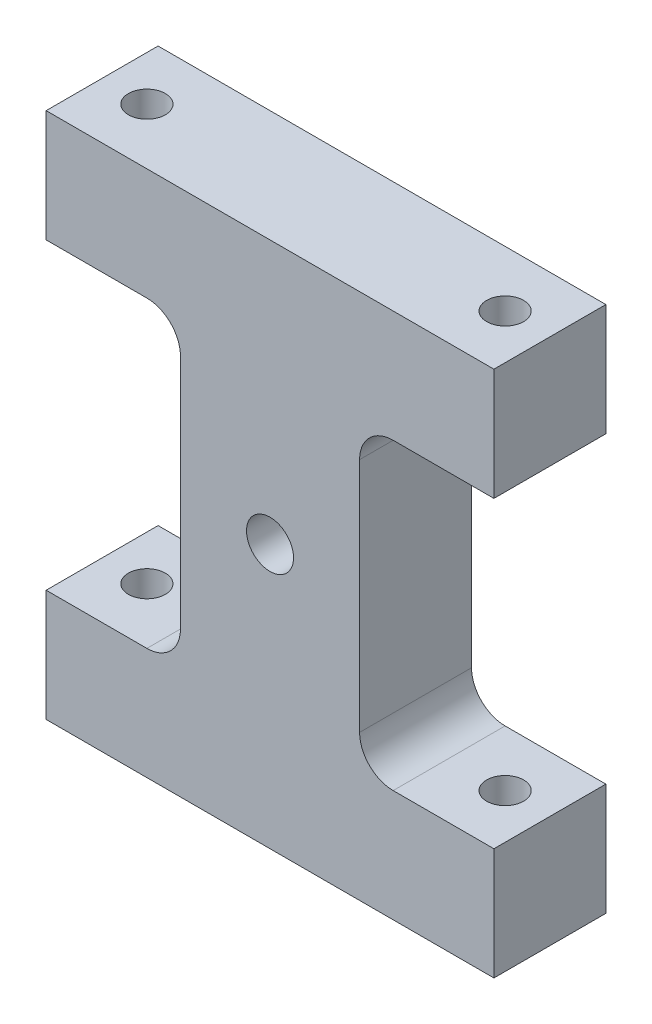
ISO-10303-21;
HEADER;
FILE_DESCRIPTION(('STEP AP214'),'2;1');
FILE_NAME('part.step','',(''),(''),'','','');
FILE_SCHEMA(('AUTOMOTIVE_DESIGN { 1 0 10303 214 1 1 1 1 }'));
ENDSEC;
DATA;
#1=APPLICATION_CONTEXT('core data for automotive mechanical design processes');
#2=APPLICATION_PROTOCOL_DEFINITION('international standard','automotive_design',2000,#1);
#3=PRODUCT_CONTEXT('',#1,'mechanical');
#4=PRODUCT('Part','Part','',(#3));
#5=PRODUCT_RELATED_PRODUCT_CATEGORY('part','',(#4));
#6=PRODUCT_DEFINITION_FORMATION('','',#4);
#7=PRODUCT_DEFINITION_CONTEXT('part definition',#1,'design');
#8=PRODUCT_DEFINITION('design','',#6,#7);
#9=PRODUCT_DEFINITION_SHAPE('','',#8);
#10=(LENGTH_UNIT() NAMED_UNIT(*) SI_UNIT(.MILLI.,.METRE.));
#11=(NAMED_UNIT(*) PLANE_ANGLE_UNIT() SI_UNIT($,.RADIAN.));
#12=(NAMED_UNIT(*) SI_UNIT($,.STERADIAN.) SOLID_ANGLE_UNIT());
#13=UNCERTAINTY_MEASURE_WITH_UNIT(LENGTH_MEASURE(1.E-05),#10,'distance_accuracy_value','');
#14=(GEOMETRIC_REPRESENTATION_CONTEXT(3) GLOBAL_UNCERTAINTY_ASSIGNED_CONTEXT((#13)) GLOBAL_UNIT_ASSIGNED_CONTEXT((#10,
#11,#12)) REPRESENTATION_CONTEXT('',''));
#15=CARTESIAN_POINT('',(0.,0.,0.));
#16=DIRECTION('',(0.,0.,1.));
#17=DIRECTION('',(1.,0.,0.));
#18=AXIS2_PLACEMENT_3D('',#15,#16,#17);
#19=CARTESIAN_POINT('',(-20.,-23.55,10.));
#20=DIRECTION('',(1.,0.,0.));
#21=DIRECTION('',(0.,0.,-1.));
#22=AXIS2_PLACEMENT_3D('',#19,#20,#21);
#23=PLANE('',#22);
#24=DIRECTION('',(0.,0.,-1.));
#25=VECTOR('',#24,1.);
#26=CARTESIAN_POINT('',(-20.,13.55,10.));
#27=LINE('',#26,#25);
#28=CARTESIAN_POINT('',(-20.,13.55,10.));
#29=VERTEX_POINT('',#28);
#30=CARTESIAN_POINT('',(-20.,13.55,0.));
#31=VERTEX_POINT('',#30);
#32=EDGE_CURVE('E209',#29,#31,#27,.T.);
#33=ORIENTED_EDGE('',*,*,#32,.F.);
#34=DIRECTION('',(0.,-1.,0.));
#35=VECTOR('',#34,1.);
#36=CARTESIAN_POINT('',(-20.,-23.55,10.));
#37=LINE('',#36,#35);
#38=CARTESIAN_POINT('',(-20.,23.55,10.));
#39=VERTEX_POINT('',#38);
#40=EDGE_CURVE('E310',#39,#29,#37,.T.);
#41=ORIENTED_EDGE('',*,*,#40,.F.);
#42=DIRECTION('',(0.,0.,-1.));
#43=VECTOR('',#42,1.);
#44=CARTESIAN_POINT('',(-20.,23.55,10.));
#45=LINE('',#44,#43);
#46=CARTESIAN_POINT('',(-20.,23.55,0.));
#47=VERTEX_POINT('',#46);
#48=EDGE_CURVE('E188',#39,#47,#45,.T.);
#49=ORIENTED_EDGE('',*,*,#48,.T.);
#50=DIRECTION('',(0.,-1.,0.));
#51=VECTOR('',#50,1.);
#52=CARTESIAN_POINT('',(-20.,-23.55,0.));
#53=LINE('',#52,#51);
#54=EDGE_CURVE('E172',#47,#31,#53,.T.);
#55=ORIENTED_EDGE('',*,*,#54,.T.);
#56=EDGE_LOOP('',(#33,#41,#49,#55));
#57=FACE_BOUND('',#56,.T.);
#58=ADVANCED_FACE('F38',(#57),#23,.F.);
#59=DIRECTION('',(0.,0.,1.));
#60=VECTOR('',#59,1.);
#61=CARTESIAN_POINT('',(-20.,-13.55,10.));
#62=LINE('',#61,#60);
#63=CARTESIAN_POINT('',(-20.,-13.55,0.));
#64=VERTEX_POINT('',#63);
#65=CARTESIAN_POINT('',(-20.,-13.55,10.));
#66=VERTEX_POINT('',#65);
#67=EDGE_CURVE('E150',#64,#66,#62,.T.);
#68=ORIENTED_EDGE('',*,*,#67,.F.);
#69=CARTESIAN_POINT('',(-20.,-23.55,0.));
#70=VERTEX_POINT('',#69);
#71=EDGE_CURVE('E161',#64,#70,#53,.T.);
#72=ORIENTED_EDGE('',*,*,#71,.T.);
#73=DIRECTION('',(0.,0.,-1.));
#74=VECTOR('',#73,1.);
#75=CARTESIAN_POINT('',(-20.,-23.55,10.));
#76=LINE('',#75,#74);
#77=CARTESIAN_POINT('',(-20.,-23.55,10.));
#78=VERTEX_POINT('',#77);
#79=EDGE_CURVE('E185',#78,#70,#76,.T.);
#80=ORIENTED_EDGE('',*,*,#79,.F.);
#81=EDGE_CURVE('E163',#66,#78,#37,.T.);
#82=ORIENTED_EDGE('',*,*,#81,.F.);
#83=EDGE_LOOP('',(#68,#72,#80,#82));
#84=FACE_BOUND('',#83,.T.);
#85=ADVANCED_FACE('F159',(#84),#23,.F.);
#86=CARTESIAN_POINT('',(0.,0.,10.));
#87=DIRECTION('',(0.,0.,-1.));
#88=DIRECTION('',(-1.,0.,0.));
#89=AXIS2_PLACEMENT_3D('',#86,#87,#88);
#90=PLANE('',#89);
#91=CARTESIAN_POINT('',(0.,0.,10.));
#92=DIRECTION('',(0.,0.,1.));
#93=DIRECTION('',(1.,0.,0.));
#94=AXIS2_PLACEMENT_3D('',#91,#92,#93);
#95=CIRCLE('',#94,2.1);
#96=CARTESIAN_POINT('',(2.1,0.,10.));
#97=VERTEX_POINT('',#96);
#98=EDGE_CURVE('E286',#97,#97,#95,.T.);
#99=ORIENTED_EDGE('',*,*,#98,.F.);
#100=EDGE_LOOP('',(#99));
#101=FACE_BOUND('',#100,.T.);
#102=DIRECTION('',(1.,0.,0.));
#103=VECTOR('',#102,1.);
#104=CARTESIAN_POINT('',(-8.,13.55,10.));
#105=LINE('',#104,#103);
#106=CARTESIAN_POINT('',(-11.,13.55,10.));
#107=VERTEX_POINT('',#106);
#108=EDGE_CURVE('E257',#29,#107,#105,.T.);
#109=ORIENTED_EDGE('',*,*,#108,.T.);
#110=CARTESIAN_POINT('',(-11.,10.55,10.));
#111=DIRECTION('',(0.,0.,-1.));
#112=DIRECTION('',(-1.,0.,0.));
#113=AXIS2_PLACEMENT_3D('',#110,#111,#112);
#114=CIRCLE('',#113,3.);
#115=CARTESIAN_POINT('',(-8.,10.55,10.));
#116=VERTEX_POINT('',#115);
#117=EDGE_CURVE('E236',#107,#116,#114,.T.);
#118=ORIENTED_EDGE('',*,*,#117,.T.);
#119=DIRECTION('',(0.,-1.,0.));
#120=VECTOR('',#119,1.);
#121=CARTESIAN_POINT('',(-8.,-13.55,10.));
#122=LINE('',#121,#120);
#123=CARTESIAN_POINT('',(-8.,-10.55,10.));
#124=VERTEX_POINT('',#123);
#125=EDGE_CURVE('E255',#116,#124,#122,.T.);
#126=ORIENTED_EDGE('',*,*,#125,.T.);
#127=CARTESIAN_POINT('',(-11.,-10.55,10.));
#128=DIRECTION('',(0.,0.,-1.));
#129=DIRECTION('',(-1.,0.,0.));
#130=AXIS2_PLACEMENT_3D('',#127,#128,#129);
#131=CIRCLE('',#130,3.);
#132=CARTESIAN_POINT('',(-11.,-13.55,10.));
#133=VERTEX_POINT('',#132);
#134=EDGE_CURVE('E46',#124,#133,#131,.T.);
#135=ORIENTED_EDGE('',*,*,#134,.T.);
#136=DIRECTION('',(-1.,0.,0.));
#137=VECTOR('',#136,1.);
#138=CARTESIAN_POINT('',(-8.,-13.55,10.));
#139=LINE('',#138,#137);
#140=EDGE_CURVE('E156',#133,#66,#139,.T.);
#141=ORIENTED_EDGE('',*,*,#140,.T.);
#142=ORIENTED_EDGE('',*,*,#81,.T.);
#143=DIRECTION('',(1.,0.,0.));
#144=VECTOR('',#143,1.);
#145=CARTESIAN_POINT('',(-20.,-23.55,10.));
#146=LINE('',#145,#144);
#147=CARTESIAN_POINT('',(20.,-23.55,10.));
#148=VERTEX_POINT('',#147);
#149=EDGE_CURVE('E186',#78,#148,#146,.T.);
#150=ORIENTED_EDGE('',*,*,#149,.T.);
#151=DIRECTION('',(0.,1.,0.));
#152=VECTOR('',#151,1.);
#153=CARTESIAN_POINT('',(20.,-23.55,10.));
#154=LINE('',#153,#152);
#155=CARTESIAN_POINT('',(20.,-13.55,10.));
#156=VERTEX_POINT('',#155);
#157=EDGE_CURVE('E305',#148,#156,#154,.T.);
#158=ORIENTED_EDGE('',*,*,#157,.T.);
#159=DIRECTION('',(1.,0.,0.));
#160=VECTOR('',#159,1.);
#161=CARTESIAN_POINT('',(8.,-13.55,10.));
#162=LINE('',#161,#160);
#163=CARTESIAN_POINT('',(11.,-13.55,10.));
#164=VERTEX_POINT('',#163);
#165=EDGE_CURVE('E268',#164,#156,#162,.T.);
#166=ORIENTED_EDGE('',*,*,#165,.F.);
#167=CARTESIAN_POINT('',(11.,-10.55,10.));
#168=DIRECTION('',(0.,0.,-1.));
#169=DIRECTION('',(-1.,0.,0.));
#170=AXIS2_PLACEMENT_3D('',#167,#168,#169);
#171=CIRCLE('',#170,3.);
#172=CARTESIAN_POINT('',(8.,-10.55,10.));
#173=VERTEX_POINT('',#172);
#174=EDGE_CURVE('E228',#164,#173,#171,.T.);
#175=ORIENTED_EDGE('',*,*,#174,.T.);
#176=DIRECTION('',(0.,-1.,0.));
#177=VECTOR('',#176,1.);
#178=CARTESIAN_POINT('',(8.,-13.55,10.));
#179=LINE('',#178,#177);
#180=CARTESIAN_POINT('',(8.,10.55,10.));
#181=VERTEX_POINT('',#180);
#182=EDGE_CURVE('E271',#181,#173,#179,.T.);
#183=ORIENTED_EDGE('',*,*,#182,.F.);
#184=CARTESIAN_POINT('',(11.,10.55,10.));
#185=DIRECTION('',(0.,0.,-1.));
#186=DIRECTION('',(-1.,0.,0.));
#187=AXIS2_PLACEMENT_3D('',#184,#185,#186);
#188=CIRCLE('',#187,3.);
#189=CARTESIAN_POINT('',(11.,13.55,10.));
#190=VERTEX_POINT('',#189);
#191=EDGE_CURVE('E232',#181,#190,#188,.T.);
#192=ORIENTED_EDGE('',*,*,#191,.T.);
#193=DIRECTION('',(-1.,0.,0.));
#194=VECTOR('',#193,1.);
#195=CARTESIAN_POINT('',(8.,13.55,10.));
#196=LINE('',#195,#194);
#197=CARTESIAN_POINT('',(20.,13.55,10.));
#198=VERTEX_POINT('',#197);
#199=EDGE_CURVE('E267',#198,#190,#196,.T.);
#200=ORIENTED_EDGE('',*,*,#199,.F.);
#201=CARTESIAN_POINT('',(20.,23.55,10.));
#202=VERTEX_POINT('',#201);
#203=EDGE_CURVE('E181',#198,#202,#154,.T.);
#204=ORIENTED_EDGE('',*,*,#203,.T.);
#205=DIRECTION('',(-1.,0.,0.));
#206=VECTOR('',#205,1.);
#207=CARTESIAN_POINT('',(-20.,23.55,10.));
#208=LINE('',#207,#206);
#209=EDGE_CURVE('E308',#202,#39,#208,.T.);
#210=ORIENTED_EDGE('',*,*,#209,.T.);
#211=ORIENTED_EDGE('',*,*,#40,.T.);
#212=EDGE_LOOP('',(#109,#118,#126,#135,#141,#142,#150,#158,#166,#175,#183,#192,#200,#204,#210,#211));
#213=FACE_BOUND('',#212,.T.);
#214=ADVANCED_FACE('F254',(#101,#213),#90,.F.);
#215=CARTESIAN_POINT('',(0.,0.,0.));
#216=DIRECTION('',(0.,0.,-1.));
#217=DIRECTION('',(-1.,0.,0.));
#218=AXIS2_PLACEMENT_3D('',#215,#216,#217);
#219=PLANE('',#218);
#220=CARTESIAN_POINT('',(0.,0.,0.));
#221=DIRECTION('',(0.,0.,-1.));
#222=DIRECTION('',(-1.,0.,0.));
#223=AXIS2_PLACEMENT_3D('',#220,#221,#222);
#224=CIRCLE('',#223,2.1);
#225=CARTESIAN_POINT('',(-2.1,0.,0.));
#226=VERTEX_POINT('',#225);
#227=EDGE_CURVE('E289',#226,#226,#224,.T.);
#228=ORIENTED_EDGE('',*,*,#227,.F.);
#229=EDGE_LOOP('',(#228));
#230=FACE_BOUND('',#229,.T.);
#231=DIRECTION('',(0.,-1.,0.));
#232=VECTOR('',#231,1.);
#233=CARTESIAN_POINT('',(-8.,-13.55,0.));
#234=LINE('',#233,#232);
#235=CARTESIAN_POINT('',(-8.,10.55,0.));
#236=VERTEX_POINT('',#235);
#237=CARTESIAN_POINT('',(-8.,-10.55,0.));
#238=VERTEX_POINT('',#237);
#239=EDGE_CURVE('E206',#236,#238,#234,.T.);
#240=ORIENTED_EDGE('',*,*,#239,.F.);
#241=CARTESIAN_POINT('',(-11.,10.55,0.));
#242=DIRECTION('',(0.,0.,-1.));
#243=DIRECTION('',(-1.,0.,0.));
#244=AXIS2_PLACEMENT_3D('',#241,#242,#243);
#245=CIRCLE('',#244,3.);
#246=CARTESIAN_POINT('',(-11.,13.55,0.));
#247=VERTEX_POINT('',#246);
#248=EDGE_CURVE('E238',#236,#247,#245,.F.);
#249=ORIENTED_EDGE('',*,*,#248,.T.);
#250=DIRECTION('',(1.,0.,0.));
#251=VECTOR('',#250,1.);
#252=CARTESIAN_POINT('',(-8.,13.55,0.));
#253=LINE('',#252,#251);
#254=EDGE_CURVE('E155',#31,#247,#253,.T.);
#255=ORIENTED_EDGE('',*,*,#254,.F.);
#256=ORIENTED_EDGE('',*,*,#54,.F.);
#257=DIRECTION('',(-1.,0.,0.));
#258=VECTOR('',#257,1.);
#259=CARTESIAN_POINT('',(-20.,23.55,0.));
#260=LINE('',#259,#258);
#261=CARTESIAN_POINT('',(20.,23.55,0.));
#262=VERTEX_POINT('',#261);
#263=EDGE_CURVE('E173',#262,#47,#260,.T.);
#264=ORIENTED_EDGE('',*,*,#263,.F.);
#265=DIRECTION('',(0.,1.,0.));
#266=VECTOR('',#265,1.);
#267=CARTESIAN_POINT('',(20.,-23.55,0.));
#268=LINE('',#267,#266);
#269=CARTESIAN_POINT('',(20.,13.55,0.));
#270=VERTEX_POINT('',#269);
#271=EDGE_CURVE('E304',#270,#262,#268,.T.);
#272=ORIENTED_EDGE('',*,*,#271,.F.);
#273=DIRECTION('',(-1.,0.,0.));
#274=VECTOR('',#273,1.);
#275=CARTESIAN_POINT('',(8.,13.55,0.));
#276=LINE('',#275,#274);
#277=CARTESIAN_POINT('',(11.,13.55,0.));
#278=VERTEX_POINT('',#277);
#279=EDGE_CURVE('E270',#270,#278,#276,.T.);
#280=ORIENTED_EDGE('',*,*,#279,.T.);
#281=CARTESIAN_POINT('',(11.,10.55,0.));
#282=DIRECTION('',(0.,0.,-1.));
#283=DIRECTION('',(-1.,0.,0.));
#284=AXIS2_PLACEMENT_3D('',#281,#282,#283);
#285=CIRCLE('',#284,3.);
#286=CARTESIAN_POINT('',(8.,10.55,0.));
#287=VERTEX_POINT('',#286);
#288=EDGE_CURVE('E234',#278,#287,#285,.F.);
#289=ORIENTED_EDGE('',*,*,#288,.T.);
#290=DIRECTION('',(0.,-1.,0.));
#291=VECTOR('',#290,1.);
#292=CARTESIAN_POINT('',(8.,-13.55,0.));
#293=LINE('',#292,#291);
#294=CARTESIAN_POINT('',(8.,-10.55,0.));
#295=VERTEX_POINT('',#294);
#296=EDGE_CURVE('E278',#287,#295,#293,.T.);
#297=ORIENTED_EDGE('',*,*,#296,.T.);
#298=CARTESIAN_POINT('',(11.,-10.55,0.));
#299=DIRECTION('',(0.,0.,-1.));
#300=DIRECTION('',(-1.,0.,0.));
#301=AXIS2_PLACEMENT_3D('',#298,#299,#300);
#302=CIRCLE('',#301,3.);
#303=CARTESIAN_POINT('',(11.,-13.55,0.));
#304=VERTEX_POINT('',#303);
#305=EDGE_CURVE('E230',#295,#304,#302,.F.);
#306=ORIENTED_EDGE('',*,*,#305,.T.);
#307=DIRECTION('',(1.,0.,0.));
#308=VECTOR('',#307,1.);
#309=CARTESIAN_POINT('',(8.,-13.55,0.));
#310=LINE('',#309,#308);
#311=CARTESIAN_POINT('',(20.,-13.55,0.));
#312=VERTEX_POINT('',#311);
#313=EDGE_CURVE('E199',#304,#312,#310,.T.);
#314=ORIENTED_EDGE('',*,*,#313,.T.);
#315=CARTESIAN_POINT('',(20.,-23.55,0.));
#316=VERTEX_POINT('',#315);
#317=EDGE_CURVE('E176',#316,#312,#268,.T.);
#318=ORIENTED_EDGE('',*,*,#317,.F.);
#319=DIRECTION('',(1.,0.,0.));
#320=VECTOR('',#319,1.);
#321=CARTESIAN_POINT('',(-20.,-23.55,0.));
#322=LINE('',#321,#320);
#323=EDGE_CURVE('E171',#70,#316,#322,.T.);
#324=ORIENTED_EDGE('',*,*,#323,.F.);
#325=ORIENTED_EDGE('',*,*,#71,.F.);
#326=DIRECTION('',(-1.,0.,0.));
#327=VECTOR('',#326,1.);
#328=CARTESIAN_POINT('',(-8.,-13.55,0.));
#329=LINE('',#328,#327);
#330=CARTESIAN_POINT('',(-11.,-13.55,0.));
#331=VERTEX_POINT('',#330);
#332=EDGE_CURVE('E147',#331,#64,#329,.T.);
#333=ORIENTED_EDGE('',*,*,#332,.F.);
#334=CARTESIAN_POINT('',(-11.,-10.55,0.));
#335=DIRECTION('',(0.,0.,-1.));
#336=DIRECTION('',(-1.,0.,0.));
#337=AXIS2_PLACEMENT_3D('',#334,#335,#336);
#338=CIRCLE('',#337,3.);
#339=EDGE_CURVE('E11',#331,#238,#338,.F.);
#340=ORIENTED_EDGE('',*,*,#339,.T.);
#341=EDGE_LOOP('',(#240,#249,#255,#256,#264,#272,#280,#289,#297,#306,#314,#318,#324,#325,#333,#340));
#342=FACE_BOUND('',#341,.T.);
#343=ADVANCED_FACE('F169',(#230,#342),#219,.T.);
#344=CARTESIAN_POINT('',(-16.,23.55,5.));
#345=DIRECTION('',(0.,1.,0.));
#346=DIRECTION('',(0.,0.,1.));
#347=AXIS2_PLACEMENT_3D('',#344,#345,#346);
#348=CYLINDRICAL_SURFACE('',#347,1.65);
#349=CARTESIAN_POINT('',(-16.,23.55,5.));
#350=DIRECTION('',(0.,1.,0.));
#351=DIRECTION('',(0.,0.,1.));
#352=AXIS2_PLACEMENT_3D('',#349,#350,#351);
#353=CIRCLE('',#352,1.65);
#354=CARTESIAN_POINT('',(-16.,23.55,6.65));
#355=VERTEX_POINT('',#354);
#356=EDGE_CURVE('E298',#355,#355,#353,.T.);
#357=ORIENTED_EDGE('',*,*,#356,.T.);
#358=EDGE_LOOP('',(#357));
#359=FACE_BOUND('',#358,.T.);
#360=CARTESIAN_POINT('',(-16.,13.55,5.));
#361=DIRECTION('',(0.,-1.,0.));
#362=DIRECTION('',(0.,0.,-1.));
#363=AXIS2_PLACEMENT_3D('',#360,#361,#362);
#364=CIRCLE('',#363,1.65);
#365=CARTESIAN_POINT('',(-16.,13.55,3.35));
#366=VERTEX_POINT('',#365);
#367=EDGE_CURVE('E164',#366,#366,#364,.F.);
#368=ORIENTED_EDGE('',*,*,#367,.F.);
#369=EDGE_LOOP('',(#368));
#370=FACE_BOUND('',#369,.T.);
#371=ADVANCED_FACE('F470',(#359,#370),#348,.F.);
#372=CARTESIAN_POINT('',(-16.,-23.55,5.));
#373=DIRECTION('',(0.,-1.,0.));
#374=DIRECTION('',(0.,0.,-1.));
#375=AXIS2_PLACEMENT_3D('',#372,#373,#374);
#376=CYLINDRICAL_SURFACE('',#375,1.65);
#377=CARTESIAN_POINT('',(-16.,-23.55,5.));
#378=DIRECTION('',(0.,-1.,0.));
#379=DIRECTION('',(0.,0.,-1.));
#380=AXIS2_PLACEMENT_3D('',#377,#378,#379);
#381=CIRCLE('',#380,1.65);
#382=CARTESIAN_POINT('',(-16.,-23.55,3.35));
#383=VERTEX_POINT('',#382);
#384=EDGE_CURVE('E292',#383,#383,#381,.T.);
#385=ORIENTED_EDGE('',*,*,#384,.T.);
#386=EDGE_LOOP('',(#385));
#387=FACE_BOUND('',#386,.T.);
#388=CARTESIAN_POINT('',(-16.,-13.55,5.));
#389=DIRECTION('',(0.,1.,0.));
#390=DIRECTION('',(0.,0.,1.));
#391=AXIS2_PLACEMENT_3D('',#388,#389,#390);
#392=CIRCLE('',#391,1.65);
#393=CARTESIAN_POINT('',(-16.,-13.55,6.65));
#394=VERTEX_POINT('',#393);
#395=EDGE_CURVE('E165',#394,#394,#392,.F.);
#396=ORIENTED_EDGE('',*,*,#395,.F.);
#397=EDGE_LOOP('',(#396));
#398=FACE_BOUND('',#397,.T.);
#399=ADVANCED_FACE('F485',(#387,#398),#376,.F.);
#400=CARTESIAN_POINT('',(20.,-23.55,10.));
#401=DIRECTION('',(-1.,0.,0.));
#402=DIRECTION('',(0.,0.,1.));
#403=AXIS2_PLACEMENT_3D('',#400,#401,#402);
#404=PLANE('',#403);
#405=ORIENTED_EDGE('',*,*,#203,.F.);
#406=DIRECTION('',(0.,0.,-1.));
#407=VECTOR('',#406,1.);
#408=CARTESIAN_POINT('',(20.,13.55,10.));
#409=LINE('',#408,#407);
#410=EDGE_CURVE('E203',#198,#270,#409,.T.);
#411=ORIENTED_EDGE('',*,*,#410,.T.);
#412=ORIENTED_EDGE('',*,*,#271,.T.);
#413=DIRECTION('',(0.,0.,-1.));
#414=VECTOR('',#413,1.);
#415=CARTESIAN_POINT('',(20.,23.55,10.));
#416=LINE('',#415,#414);
#417=EDGE_CURVE('E191',#202,#262,#416,.T.);
#418=ORIENTED_EDGE('',*,*,#417,.F.);
#419=EDGE_LOOP('',(#405,#411,#412,#418));
#420=FACE_BOUND('',#419,.T.);
#421=ADVANCED_FACE('F319',(#420),#404,.F.);
#422=ORIENTED_EDGE('',*,*,#317,.T.);
#423=DIRECTION('',(0.,0.,1.));
#424=VECTOR('',#423,1.);
#425=CARTESIAN_POINT('',(20.,-13.55,10.));
#426=LINE('',#425,#424);
#427=EDGE_CURVE('E198',#312,#156,#426,.T.);
#428=ORIENTED_EDGE('',*,*,#427,.T.);
#429=ORIENTED_EDGE('',*,*,#157,.F.);
#430=DIRECTION('',(0.,0.,-1.));
#431=VECTOR('',#430,1.);
#432=CARTESIAN_POINT('',(20.,-23.55,10.));
#433=LINE('',#432,#431);
#434=EDGE_CURVE('E182',#148,#316,#433,.T.);
#435=ORIENTED_EDGE('',*,*,#434,.T.);
#436=EDGE_LOOP('',(#422,#428,#429,#435));
#437=FACE_BOUND('',#436,.T.);
#438=ADVANCED_FACE('F348',(#437),#404,.F.);
#439=CARTESIAN_POINT('',(-20.,23.55,10.));
#440=DIRECTION('',(0.,-1.,0.));
#441=DIRECTION('',(0.,0.,-1.));
#442=AXIS2_PLACEMENT_3D('',#439,#440,#441);
#443=PLANE('',#442);
#444=ORIENTED_EDGE('',*,*,#356,.F.);
#445=EDGE_LOOP('',(#444));
#446=FACE_BOUND('',#445,.T.);
#447=CARTESIAN_POINT('',(16.,23.55,4.99999999999999));
#448=DIRECTION('',(0.,1.,0.));
#449=DIRECTION('',(0.,0.,1.));
#450=AXIS2_PLACEMENT_3D('',#447,#448,#449);
#451=CIRCLE('',#450,1.65);
#452=CARTESIAN_POINT('',(16.,23.55,6.64999999999999));
#453=VERTEX_POINT('',#452);
#454=EDGE_CURVE('E301',#453,#453,#451,.T.);
#455=ORIENTED_EDGE('',*,*,#454,.F.);
#456=EDGE_LOOP('',(#455));
#457=FACE_BOUND('',#456,.T.);
#458=ORIENTED_EDGE('',*,*,#263,.T.);
#459=ORIENTED_EDGE('',*,*,#48,.F.);
#460=ORIENTED_EDGE('',*,*,#209,.F.);
#461=ORIENTED_EDGE('',*,*,#417,.T.);
#462=EDGE_LOOP('',(#458,#459,#460,#461));
#463=FACE_BOUND('',#462,.T.);
#464=ADVANCED_FACE('F323',(#446,#457,#463),#443,.F.);
#465=CARTESIAN_POINT('',(-20.,-23.55,10.));
#466=DIRECTION('',(0.,1.,0.));
#467=DIRECTION('',(0.,0.,1.));
#468=AXIS2_PLACEMENT_3D('',#465,#466,#467);
#469=PLANE('',#468);
#470=ORIENTED_EDGE('',*,*,#384,.F.);
#471=EDGE_LOOP('',(#470));
#472=FACE_BOUND('',#471,.T.);
#473=CARTESIAN_POINT('',(16.,-23.55,4.99999999999999));
#474=DIRECTION('',(0.,-1.,0.));
#475=DIRECTION('',(0.,0.,-1.));
#476=AXIS2_PLACEMENT_3D('',#473,#474,#475);
#477=CIRCLE('',#476,1.65);
#478=CARTESIAN_POINT('',(16.,-23.55,3.34999999999999));
#479=VERTEX_POINT('',#478);
#480=EDGE_CURVE('E295',#479,#479,#477,.T.);
#481=ORIENTED_EDGE('',*,*,#480,.F.);
#482=EDGE_LOOP('',(#481));
#483=FACE_BOUND('',#482,.T.);
#484=ORIENTED_EDGE('',*,*,#323,.T.);
#485=ORIENTED_EDGE('',*,*,#434,.F.);
#486=ORIENTED_EDGE('',*,*,#149,.F.);
#487=ORIENTED_EDGE('',*,*,#79,.T.);
#488=EDGE_LOOP('',(#484,#485,#486,#487));
#489=FACE_BOUND('',#488,.T.);
#490=ADVANCED_FACE('F352',(#472,#483,#489),#469,.F.);
#491=CARTESIAN_POINT('',(16.,23.55,4.99999999999999));
#492=DIRECTION('',(0.,1.,0.));
#493=DIRECTION('',(0.,0.,1.));
#494=AXIS2_PLACEMENT_3D('',#491,#492,#493);
#495=CYLINDRICAL_SURFACE('',#494,1.65);
#496=CARTESIAN_POINT('',(16.,13.55,4.99999999999999));
#497=DIRECTION('',(0.,1.,0.));
#498=DIRECTION('',(0.,0.,1.));
#499=AXIS2_PLACEMENT_3D('',#496,#497,#498);
#500=CIRCLE('',#499,1.65);
#501=CARTESIAN_POINT('',(16.,13.55,6.64999999999999));
#502=VERTEX_POINT('',#501);
#503=EDGE_CURVE('E200',#502,#502,#500,.F.);
#504=ORIENTED_EDGE('',*,*,#503,.T.);
#505=EDGE_LOOP('',(#504));
#506=FACE_BOUND('',#505,.T.);
#507=ORIENTED_EDGE('',*,*,#454,.T.);
#508=EDGE_LOOP('',(#507));
#509=FACE_BOUND('',#508,.T.);
#510=ADVANCED_FACE('F354',(#506,#509),#495,.F.);
#511=CARTESIAN_POINT('',(16.,-23.55,4.99999999999999));
#512=DIRECTION('',(0.,-1.,0.));
#513=DIRECTION('',(0.,0.,-1.));
#514=AXIS2_PLACEMENT_3D('',#511,#512,#513);
#515=CYLINDRICAL_SURFACE('',#514,1.65);
#516=CARTESIAN_POINT('',(16.,-13.55,4.99999999999999));
#517=DIRECTION('',(0.,-1.,0.));
#518=DIRECTION('',(0.,0.,-1.));
#519=AXIS2_PLACEMENT_3D('',#516,#517,#518);
#520=CIRCLE('',#519,1.65);
#521=CARTESIAN_POINT('',(16.,-13.55,3.34999999999999));
#522=VERTEX_POINT('',#521);
#523=EDGE_CURVE('E195',#522,#522,#520,.F.);
#524=ORIENTED_EDGE('',*,*,#523,.T.);
#525=EDGE_LOOP('',(#524));
#526=FACE_BOUND('',#525,.T.);
#527=ORIENTED_EDGE('',*,*,#480,.T.);
#528=EDGE_LOOP('',(#527));
#529=FACE_BOUND('',#528,.T.);
#530=ADVANCED_FACE('F362',(#526,#529),#515,.F.);
#531=CARTESIAN_POINT('',(0.,0.,10.));
#532=DIRECTION('',(0.,0.,1.));
#533=DIRECTION('',(1.,0.,0.));
#534=AXIS2_PLACEMENT_3D('',#531,#532,#533);
#535=CYLINDRICAL_SURFACE('',#534,2.1);
#536=ORIENTED_EDGE('',*,*,#227,.T.);
#537=EDGE_LOOP('',(#536));
#538=FACE_BOUND('',#537,.T.);
#539=ORIENTED_EDGE('',*,*,#98,.T.);
#540=EDGE_LOOP('',(#539));
#541=FACE_BOUND('',#540,.T.);
#542=ADVANCED_FACE('F459',(#538,#541),#535,.F.);
#543=CARTESIAN_POINT('',(8.,13.55,-36.1995856329876));
#544=DIRECTION('',(0.,1.,0.));
#545=DIRECTION('',(0.,0.,1.));
#546=AXIS2_PLACEMENT_3D('',#543,#544,#545);
#547=PLANE('',#546);
#548=ORIENTED_EDGE('',*,*,#503,.F.);
#549=EDGE_LOOP('',(#548));
#550=FACE_BOUND('',#549,.T.);
#551=ORIENTED_EDGE('',*,*,#199,.T.);
#552=DIRECTION('',(0.,0.,1.));
#553=VECTOR('',#552,1.);
#554=CARTESIAN_POINT('',(11.,13.55,0.));
#555=LINE('',#554,#553);
#556=EDGE_CURVE('E217',#190,#278,#555,.F.);
#557=ORIENTED_EDGE('',*,*,#556,.T.);
#558=ORIENTED_EDGE('',*,*,#279,.F.);
#559=ORIENTED_EDGE('',*,*,#410,.F.);
#560=EDGE_LOOP('',(#551,#557,#558,#559));
#561=FACE_BOUND('',#560,.T.);
#562=ADVANCED_FACE('F329',(#550,#561),#547,.F.);
#563=CARTESIAN_POINT('',(8.,-13.55,-36.1995856329876));
#564=DIRECTION('',(0.,-1.,0.));
#565=DIRECTION('',(0.,0.,-1.));
#566=AXIS2_PLACEMENT_3D('',#563,#564,#565);
#567=PLANE('',#566);
#568=ORIENTED_EDGE('',*,*,#523,.F.);
#569=EDGE_LOOP('',(#568));
#570=FACE_BOUND('',#569,.T.);
#571=ORIENTED_EDGE('',*,*,#313,.F.);
#572=DIRECTION('',(0.,0.,1.));
#573=VECTOR('',#572,1.);
#574=CARTESIAN_POINT('',(11.,-13.55,10.));
#575=LINE('',#574,#573);
#576=EDGE_CURVE('E194',#304,#164,#575,.T.);
#577=ORIENTED_EDGE('',*,*,#576,.T.);
#578=ORIENTED_EDGE('',*,*,#165,.T.);
#579=ORIENTED_EDGE('',*,*,#427,.F.);
#580=EDGE_LOOP('',(#571,#577,#578,#579));
#581=FACE_BOUND('',#580,.T.);
#582=ADVANCED_FACE('F345',(#570,#581),#567,.F.);
#583=CARTESIAN_POINT('',(8.,-13.55,-36.1995856329876));
#584=DIRECTION('',(-1.,0.,0.));
#585=DIRECTION('',(0.,0.,1.));
#586=AXIS2_PLACEMENT_3D('',#583,#584,#585);
#587=PLANE('',#586);
#588=ORIENTED_EDGE('',*,*,#182,.T.);
#589=DIRECTION('',(0.,0.,1.));
#590=VECTOR('',#589,1.);
#591=CARTESIAN_POINT('',(8.,-10.55,0.));
#592=LINE('',#591,#590);
#593=EDGE_CURVE('E215',#173,#295,#592,.F.);
#594=ORIENTED_EDGE('',*,*,#593,.T.);
#595=ORIENTED_EDGE('',*,*,#296,.F.);
#596=DIRECTION('',(0.,0.,1.));
#597=VECTOR('',#596,1.);
#598=CARTESIAN_POINT('',(8.,10.55,10.));
#599=LINE('',#598,#597);
#600=EDGE_CURVE('E212',#287,#181,#599,.T.);
#601=ORIENTED_EDGE('',*,*,#600,.T.);
#602=EDGE_LOOP('',(#588,#594,#595,#601));
#603=FACE_BOUND('',#602,.T.);
#604=ADVANCED_FACE('F337',(#603),#587,.F.);
#605=CARTESIAN_POINT('',(-8.,13.55,-36.1995856329876));
#606=DIRECTION('',(0.,-1.,0.));
#607=DIRECTION('',(0.,0.,-1.));
#608=AXIS2_PLACEMENT_3D('',#605,#606,#607);
#609=PLANE('',#608);
#610=ORIENTED_EDGE('',*,*,#367,.T.);
#611=EDGE_LOOP('',(#610));
#612=FACE_BOUND('',#611,.T.);
#613=ORIENTED_EDGE('',*,*,#254,.T.);
#614=DIRECTION('',(0.,0.,1.));
#615=VECTOR('',#614,1.);
#616=CARTESIAN_POINT('',(-11.,13.55,10.));
#617=LINE('',#616,#615);
#618=EDGE_CURVE('E219',#247,#107,#617,.T.);
#619=ORIENTED_EDGE('',*,*,#618,.T.);
#620=ORIENTED_EDGE('',*,*,#108,.F.);
#621=ORIENTED_EDGE('',*,*,#32,.T.);
#622=EDGE_LOOP('',(#613,#619,#620,#621));
#623=FACE_BOUND('',#622,.T.);
#624=ADVANCED_FACE('F248',(#612,#623),#609,.T.);
#625=CARTESIAN_POINT('',(-8.,-13.55,-36.1995856329876));
#626=DIRECTION('',(0.,1.,0.));
#627=DIRECTION('',(0.,0.,1.));
#628=AXIS2_PLACEMENT_3D('',#625,#626,#627);
#629=PLANE('',#628);
#630=ORIENTED_EDGE('',*,*,#395,.T.);
#631=EDGE_LOOP('',(#630));
#632=FACE_BOUND('',#631,.T.);
#633=ORIENTED_EDGE('',*,*,#140,.F.);
#634=DIRECTION('',(0.,0.,1.));
#635=VECTOR('',#634,1.);
#636=CARTESIAN_POINT('',(-11.,-13.55,0.));
#637=LINE('',#636,#635);
#638=EDGE_CURVE('E53',#133,#331,#637,.F.);
#639=ORIENTED_EDGE('',*,*,#638,.T.);
#640=ORIENTED_EDGE('',*,*,#332,.T.);
#641=ORIENTED_EDGE('',*,*,#67,.T.);
#642=EDGE_LOOP('',(#633,#639,#640,#641));
#643=FACE_BOUND('',#642,.T.);
#644=ADVANCED_FACE('F149',(#632,#643),#629,.T.);
#645=CARTESIAN_POINT('',(-8.,-13.55,-36.1995856329876));
#646=DIRECTION('',(-1.,0.,0.));
#647=DIRECTION('',(0.,0.,1.));
#648=AXIS2_PLACEMENT_3D('',#645,#646,#647);
#649=PLANE('',#648);
#650=ORIENTED_EDGE('',*,*,#125,.F.);
#651=DIRECTION('',(0.,0.,1.));
#652=VECTOR('',#651,1.);
#653=CARTESIAN_POINT('',(-8.,10.55,0.));
#654=LINE('',#653,#652);
#655=EDGE_CURVE('E225',#116,#236,#654,.F.);
#656=ORIENTED_EDGE('',*,*,#655,.T.);
#657=ORIENTED_EDGE('',*,*,#239,.T.);
#658=DIRECTION('',(0.,0.,1.));
#659=VECTOR('',#658,1.);
#660=CARTESIAN_POINT('',(-8.,-10.55,10.));
#661=LINE('',#660,#659);
#662=EDGE_CURVE('E222',#238,#124,#661,.T.);
#663=ORIENTED_EDGE('',*,*,#662,.T.);
#664=EDGE_LOOP('',(#650,#656,#657,#663));
#665=FACE_BOUND('',#664,.T.);
#666=ADVANCED_FACE('F259',(#665),#649,.T.);
#667=CARTESIAN_POINT('',(11.,-10.55,-36.1995856329876));
#668=DIRECTION('',(0.,0.,-1.));
#669=DIRECTION('',(-1.,0.,0.));
#670=AXIS2_PLACEMENT_3D('',#667,#668,#669);
#671=CYLINDRICAL_SURFACE('',#670,3.);
#672=ORIENTED_EDGE('',*,*,#305,.F.);
#673=ORIENTED_EDGE('',*,*,#593,.F.);
#674=ORIENTED_EDGE('',*,*,#174,.F.);
#675=ORIENTED_EDGE('',*,*,#576,.F.);
#676=EDGE_LOOP('',(#672,#673,#674,#675));
#677=FACE_BOUND('',#676,.T.);
#678=ADVANCED_FACE('F340',(#677),#671,.F.);
#679=CARTESIAN_POINT('',(11.,10.55,-36.1995856329876));
#680=DIRECTION('',(0.,0.,-1.));
#681=DIRECTION('',(-1.,0.,0.));
#682=AXIS2_PLACEMENT_3D('',#679,#680,#681);
#683=CYLINDRICAL_SURFACE('',#682,3.);
#684=ORIENTED_EDGE('',*,*,#288,.F.);
#685=ORIENTED_EDGE('',*,*,#556,.F.);
#686=ORIENTED_EDGE('',*,*,#191,.F.);
#687=ORIENTED_EDGE('',*,*,#600,.F.);
#688=EDGE_LOOP('',(#684,#685,#686,#687));
#689=FACE_BOUND('',#688,.T.);
#690=ADVANCED_FACE('F332',(#689),#683,.F.);
#691=CARTESIAN_POINT('',(-11.,10.55,-36.1995856329876));
#692=DIRECTION('',(0.,0.,-1.));
#693=DIRECTION('',(-1.,0.,0.));
#694=AXIS2_PLACEMENT_3D('',#691,#692,#693);
#695=CYLINDRICAL_SURFACE('',#694,3.);
#696=ORIENTED_EDGE('',*,*,#248,.F.);
#697=ORIENTED_EDGE('',*,*,#655,.F.);
#698=ORIENTED_EDGE('',*,*,#117,.F.);
#699=ORIENTED_EDGE('',*,*,#618,.F.);
#700=EDGE_LOOP('',(#696,#697,#698,#699));
#701=FACE_BOUND('',#700,.T.);
#702=ADVANCED_FACE('F252',(#701),#695,.F.);
#703=CARTESIAN_POINT('',(-11.,-10.55,-36.1995856329876));
#704=DIRECTION('',(0.,0.,-1.));
#705=DIRECTION('',(-1.,0.,0.));
#706=AXIS2_PLACEMENT_3D('',#703,#704,#705);
#707=CYLINDRICAL_SURFACE('',#706,3.);
#708=ORIENTED_EDGE('',*,*,#339,.F.);
#709=ORIENTED_EDGE('',*,*,#638,.F.);
#710=ORIENTED_EDGE('',*,*,#134,.F.);
#711=ORIENTED_EDGE('',*,*,#662,.F.);
#712=EDGE_LOOP('',(#708,#709,#710,#711));
#713=FACE_BOUND('',#712,.T.);
#714=ADVANCED_FACE('F40',(#713),#707,.F.);
#715=CLOSED_SHELL('',(#58,#85,#214,#343,#371,#399,#421,#438,#464,#490,#510,#530,#542,#562,#582,
#604,#624,#644,#666,#678,#690,#702,#714));
#716=MANIFOLD_SOLID_BREP('B2',#715);
#717=ADVANCED_BREP_SHAPE_REPRESENTATION('',(#18,#716),#14);
#718=SHAPE_DEFINITION_REPRESENTATION(#9,#717);
ENDSEC;
END-ISO-10303-21;
